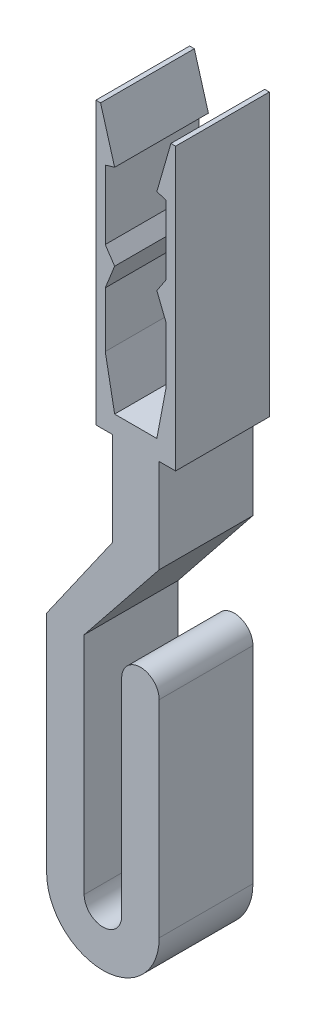
ISO-10303-21;
HEADER;
FILE_DESCRIPTION(('STEP AP214'),'2;1');
FILE_NAME('part.step','',(''),(''),'','','');
FILE_SCHEMA(('AUTOMOTIVE_DESIGN { 1 0 10303 214 1 1 1 1 }'));
ENDSEC;
DATA;
#1=APPLICATION_CONTEXT('core data for automotive mechanical design processes');
#2=APPLICATION_PROTOCOL_DEFINITION('international standard','automotive_design',2000,#1);
#3=PRODUCT_CONTEXT('',#1,'mechanical');
#4=PRODUCT('Part','Part','',(#3));
#5=PRODUCT_RELATED_PRODUCT_CATEGORY('part','',(#4));
#6=PRODUCT_DEFINITION_FORMATION('','',#4);
#7=PRODUCT_DEFINITION_CONTEXT('part definition',#1,'design');
#8=PRODUCT_DEFINITION('design','',#6,#7);
#9=PRODUCT_DEFINITION_SHAPE('','',#8);
#10=(LENGTH_UNIT() NAMED_UNIT(*) SI_UNIT(.MILLI.,.METRE.));
#11=(NAMED_UNIT(*) PLANE_ANGLE_UNIT() SI_UNIT($,.RADIAN.));
#12=(NAMED_UNIT(*) SI_UNIT($,.STERADIAN.) SOLID_ANGLE_UNIT());
#13=UNCERTAINTY_MEASURE_WITH_UNIT(LENGTH_MEASURE(1.E-05),#10,'distance_accuracy_value','');
#14=(GEOMETRIC_REPRESENTATION_CONTEXT(3) GLOBAL_UNCERTAINTY_ASSIGNED_CONTEXT((#13)) GLOBAL_UNIT_ASSIGNED_CONTEXT((#10,
#11,#12)) REPRESENTATION_CONTEXT('',''));
#15=CARTESIAN_POINT('',(0.,0.,0.));
#16=DIRECTION('',(0.,0.,1.));
#17=DIRECTION('',(1.,0.,0.));
#18=AXIS2_PLACEMENT_3D('',#15,#16,#17);
#19=CARTESIAN_POINT('',(0.85,-5.248,0.1));
#20=DIRECTION('',(0.,0.,-1.));
#21=DIRECTION('',(0.,-1.,0.));
#22=AXIS2_PLACEMENT_3D('',#19,#20,#21);
#23=PLANE('',#22);
#24=DIRECTION('',(-1.,0.,0.));
#25=VECTOR('',#24,1.);
#26=CARTESIAN_POINT('',(0.85,-0.2,0.1));
#27=LINE('',#26,#25);
#28=CARTESIAN_POINT('',(0.175,-0.2,0.1));
#29=VERTEX_POINT('',#28);
#30=CARTESIAN_POINT('',(0.,-0.2,0.1));
#31=VERTEX_POINT('',#30);
#32=EDGE_CURVE('E377',#29,#31,#27,.T.);
#33=ORIENTED_EDGE('',*,*,#32,.F.);
#34=DIRECTION('',(0.,1.,0.));
#35=VECTOR('',#34,1.);
#36=CARTESIAN_POINT('',(0.175,-1.2,0.1));
#37=LINE('',#36,#35);
#38=CARTESIAN_POINT('',(0.175,-1.2,0.1));
#39=VERTEX_POINT('',#38);
#40=EDGE_CURVE('E322',#39,#29,#37,.T.);
#41=ORIENTED_EDGE('',*,*,#40,.F.);
#42=DIRECTION('',(0.573462344363328,0.819231920519041,0.));
#43=VECTOR('',#42,1.);
#44=CARTESIAN_POINT('',(-1.50476510067114,-3.5996644295302,0.1));
#45=LINE('',#44,#43);
#46=CARTESIAN_POINT('',(-0.525,-2.2,0.1));
#47=VERTEX_POINT('',#46);
#48=EDGE_CURVE('E363',#47,#39,#45,.T.);
#49=ORIENTED_EDGE('',*,*,#48,.F.);
#50=DIRECTION('',(0.,1.,0.));
#51=VECTOR('',#50,1.);
#52=CARTESIAN_POINT('',(-0.525,-5.248,0.1));
#53=LINE('',#52,#51);
#54=CARTESIAN_POINT('',(-0.525,-4.60000000011806,0.1));
#55=VERTEX_POINT('',#54);
#56=EDGE_CURVE('E462',#55,#47,#53,.T.);
#57=ORIENTED_EDGE('',*,*,#56,.F.);
#58=CARTESIAN_POINT('',(0.075,-4.6,0.1));
#59=DIRECTION('',(0.,0.,-1.));
#60=DIRECTION('',(1.,0.,0.));
#61=AXIS2_PLACEMENT_3D('',#58,#59,#60);
#62=CIRCLE('',#61,0.60000000001);
#63=CARTESIAN_POINT('',(0.675,-4.60000000005888,0.1));
#64=VERTEX_POINT('',#63);
#65=EDGE_CURVE('E341',#64,#55,#62,.T.);
#66=ORIENTED_EDGE('',*,*,#65,.F.);
#67=DIRECTION('',(0.,-1.,0.));
#68=VECTOR('',#67,1.);
#69=CARTESIAN_POINT('',(0.675,-5.248,0.1));
#70=LINE('',#69,#68);
#71=CARTESIAN_POINT('',(0.675,-2.400000000005,0.1));
#72=VERTEX_POINT('',#71);
#73=EDGE_CURVE('E303',#72,#64,#70,.T.);
#74=ORIENTED_EDGE('',*,*,#73,.F.);
#75=CARTESIAN_POINT('',(0.475,-2.4,0.1));
#76=DIRECTION('',(0.,0.,-1.));
#77=DIRECTION('',(1.,0.,0.));
#78=AXIS2_PLACEMENT_3D('',#75,#76,#77);
#79=CIRCLE('',#78,0.20000000001);
#80=CARTESIAN_POINT('',(0.275,-2.40000000003602,0.1));
#81=VERTEX_POINT('',#80);
#82=EDGE_CURVE('E387',#81,#72,#79,.T.);
#83=ORIENTED_EDGE('',*,*,#82,.F.);
#84=DIRECTION('',(0.,1.,0.));
#85=VECTOR('',#84,1.);
#86=CARTESIAN_POINT('',(0.275,-5.248,0.1));
#87=LINE('',#86,#85);
#88=CARTESIAN_POINT('',(0.275,-4.60000000002296,0.1));
#89=VERTEX_POINT('',#88);
#90=EDGE_CURVE('E463',#89,#81,#87,.T.);
#91=ORIENTED_EDGE('',*,*,#90,.F.);
#92=CARTESIAN_POINT('',(0.075,-4.6,0.1));
#93=DIRECTION('',(0.,0.,1.));
#94=DIRECTION('',(1.,0.,0.));
#95=AXIS2_PLACEMENT_3D('',#92,#93,#94);
#96=CIRCLE('',#95,0.20000000001);
#97=CARTESIAN_POINT('',(-0.125000000005,-4.60000000003602,0.1));
#98=VERTEX_POINT('',#97);
#99=EDGE_CURVE('E251',#98,#89,#96,.T.);
#100=ORIENTED_EDGE('',*,*,#99,.F.);
#101=DIRECTION('',(0.,-1.,0.));
#102=VECTOR('',#101,1.);
#103=CARTESIAN_POINT('',(-0.125,-5.248,0.1));
#104=LINE('',#103,#102);
#105=CARTESIAN_POINT('',(-0.125,-2.2,0.1));
#106=VERTEX_POINT('',#105);
#107=EDGE_CURVE('E248',#106,#98,#104,.T.);
#108=ORIENTED_EDGE('',*,*,#107,.F.);
#109=DIRECTION('',(-0.624695047554424,-0.78086880944303,0.));
#110=VECTOR('',#109,1.);
#111=CARTESIAN_POINT('',(-1.23134146341463,-3.58292682926829,0.1));
#112=LINE('',#111,#110);
#113=CARTESIAN_POINT('',(0.675,-1.2,0.1));
#114=VERTEX_POINT('',#113);
#115=EDGE_CURVE('E234',#114,#106,#112,.T.);
#116=ORIENTED_EDGE('',*,*,#115,.F.);
#117=DIRECTION('',(0.,-1.,0.));
#118=VECTOR('',#117,1.);
#119=CARTESIAN_POINT('',(0.675,-1.2,0.1));
#120=LINE('',#119,#118);
#121=CARTESIAN_POINT('',(0.675,-0.2,0.1));
#122=VERTEX_POINT('',#121);
#123=EDGE_CURVE('E245',#122,#114,#120,.T.);
#124=ORIENTED_EDGE('',*,*,#123,.F.);
#125=DIRECTION('',(-1.,0.,0.));
#126=VECTOR('',#125,1.);
#127=CARTESIAN_POINT('',(0.85,-0.2,0.1));
#128=LINE('',#127,#126);
#129=CARTESIAN_POINT('',(0.85,-0.2,0.1));
#130=VERTEX_POINT('',#129);
#131=EDGE_CURVE('E408',#130,#122,#128,.T.);
#132=ORIENTED_EDGE('',*,*,#131,.F.);
#133=DIRECTION('',(0.,-1.,0.));
#134=VECTOR('',#133,1.);
#135=CARTESIAN_POINT('',(0.85,-5.248,0.1));
#136=LINE('',#135,#134);
#137=CARTESIAN_POINT('',(0.85,2.8,0.1));
#138=VERTEX_POINT('',#137);
#139=EDGE_CURVE('E404',#138,#130,#136,.T.);
#140=ORIENTED_EDGE('',*,*,#139,.F.);
#141=DIRECTION('',(1.,0.,0.));
#142=VECTOR('',#141,1.);
#143=CARTESIAN_POINT('',(0.85,2.8,0.1));
#144=LINE('',#143,#142);
#145=CARTESIAN_POINT('',(0.8,2.8,0.1));
#146=VERTEX_POINT('',#145);
#147=EDGE_CURVE('E329',#146,#138,#144,.T.);
#148=ORIENTED_EDGE('',*,*,#147,.F.);
#149=DIRECTION('',(0.276944772428183,0.960885837664757,0.));
#150=VECTOR('',#149,1.);
#151=CARTESIAN_POINT('',(-1.33783694764627,-4.61742560518073,0.1));
#152=LINE('',#151,#150);
#153=CARTESIAN_POINT('',(0.65,2.279560945,0.1));
#154=VERTEX_POINT('',#153);
#155=EDGE_CURVE('E328',#154,#146,#152,.T.);
#156=ORIENTED_EDGE('',*,*,#155,.F.);
#157=DIRECTION('',(-0.960885839024237,0.276944767711341,0.));
#158=VECTOR('',#157,1.);
#159=CARTESIAN_POINT('',(2.83783691688541,1.64898657067847,0.1));
#160=LINE('',#159,#158);
#161=CARTESIAN_POINT('',(0.75,2.250739127,0.1));
#162=VERTEX_POINT('',#161);
#163=EDGE_CURVE('E474',#162,#154,#160,.T.);
#164=ORIENTED_EDGE('',*,*,#163,.F.);
#165=DIRECTION('',(0.,1.,0.));
#166=VECTOR('',#165,1.);
#167=CARTESIAN_POINT('',(0.75,-5.248,0.1));
#168=LINE('',#167,#166);
#169=CARTESIAN_POINT('',(0.75,1.516264803,0.1));
#170=VERTEX_POINT('',#169);
#171=EDGE_CURVE('E473',#170,#162,#168,.T.);
#172=ORIENTED_EDGE('',*,*,#171,.F.);
#173=DIRECTION('',(0.55470019622523,0.832050294337843,0.));
#174=VECTOR('',#173,1.);
#175=CARTESIAN_POINT('',(-2.34119913984616,-3.12053390676923,0.1));
#176=LINE('',#175,#174);
#177=CARTESIAN_POINT('',(0.65,1.366264803,0.1));
#178=VERTEX_POINT('',#177);
#179=EDGE_CURVE('E370',#178,#170,#176,.T.);
#180=ORIENTED_EDGE('',*,*,#179,.F.);
#181=DIRECTION('',(-0.371390676354104,0.928476690885259,0.));
#182=VECTOR('',#181,1.);
#183=CARTESIAN_POINT('',(2.95836717344828,-4.40465313062069,0.1));
#184=LINE('',#183,#182);
#185=CARTESIAN_POINT('',(0.75,1.116264803,0.1));
#186=VERTEX_POINT('',#185);
#187=EDGE_CURVE('E284',#186,#178,#184,.T.);
#188=ORIENTED_EDGE('',*,*,#187,.F.);
#189=DIRECTION('',(0.,1.,0.));
#190=VECTOR('',#189,1.);
#191=CARTESIAN_POINT('',(0.75,-5.248,0.1));
#192=LINE('',#191,#190);
#193=CARTESIAN_POINT('',(0.75,0.527464379,0.1));
#194=VERTEX_POINT('',#193);
#195=EDGE_CURVE('E442',#194,#186,#192,.T.);
#196=ORIENTED_EDGE('',*,*,#195,.F.);
#197=DIRECTION('',(0.186268297140006,0.982498916783404,0.));
#198=VECTOR('',#197,1.);
#199=CARTESIAN_POINT('',(-0.30348890839428,-5.02931434949576,0.1));
#200=LINE('',#199,#198);
#201=CARTESIAN_POINT('',(0.65,0.,0.1));
#202=VERTEX_POINT('',#201);
#203=EDGE_CURVE('E308',#202,#194,#200,.T.);
#204=ORIENTED_EDGE('',*,*,#203,.F.);
#205=DIRECTION('',(-1.,0.,0.));
#206=VECTOR('',#205,1.);
#207=CARTESIAN_POINT('',(0.85,0.,0.1));
#208=LINE('',#207,#206);
#209=CARTESIAN_POINT('',(0.2,0.,0.1));
#210=VERTEX_POINT('',#209);
#211=EDGE_CURVE('E293',#202,#210,#208,.T.);
#212=ORIENTED_EDGE('',*,*,#211,.T.);
#213=DIRECTION('',(-0.186268297140006,0.982498916783404,0.));
#214=VECTOR('',#213,1.);
#215=CARTESIAN_POINT('',(1.1829804051358,-5.18487148964124,0.1));
#216=LINE('',#215,#214);
#217=CARTESIAN_POINT('',(0.1,0.527464379000001,0.1));
#218=VERTEX_POINT('',#217);
#219=EDGE_CURVE('E292',#210,#218,#216,.T.);
#220=ORIENTED_EDGE('',*,*,#219,.T.);
#221=DIRECTION('',(0.,1.,0.));
#222=VECTOR('',#221,1.);
#223=CARTESIAN_POINT('',(0.1,-5.248,0.1));
#224=LINE('',#223,#222);
#225=CARTESIAN_POINT('',(0.1,1.116264803,0.1));
#226=VERTEX_POINT('',#225);
#227=EDGE_CURVE('E554',#218,#226,#224,.T.);
#228=ORIENTED_EDGE('',*,*,#227,.T.);
#229=DIRECTION('',(0.371390676354104,0.928476690885259,0.));
#230=VECTOR('',#229,1.);
#231=CARTESIAN_POINT('',(-1.99112579413793,-4.11154968234483,0.1));
#232=LINE('',#231,#230);
#233=CARTESIAN_POINT('',(0.2,1.366264803,0.1));
#234=VERTEX_POINT('',#233);
#235=EDGE_CURVE('E392',#226,#234,#232,.T.);
#236=ORIENTED_EDGE('',*,*,#235,.T.);
#237=DIRECTION('',(-0.554700196225229,0.832050294337844,0.));
#238=VECTOR('',#237,1.);
#239=CARTESIAN_POINT('',(3.45273760138462,-3.51284159907692,0.1));
#240=LINE('',#239,#238);
#241=CARTESIAN_POINT('',(0.1,1.516264803,0.1));
#242=VERTEX_POINT('',#241);
#243=EDGE_CURVE('E479',#234,#242,#240,.T.);
#244=ORIENTED_EDGE('',*,*,#243,.T.);
#245=DIRECTION('',(0.,1.,0.));
#246=VECTOR('',#245,1.);
#247=CARTESIAN_POINT('',(0.1,-5.248,0.1));
#248=LINE('',#247,#246);
#249=CARTESIAN_POINT('',(0.1,2.250739127,0.1));
#250=VERTEX_POINT('',#249);
#251=EDGE_CURVE('E398',#242,#250,#248,.T.);
#252=ORIENTED_EDGE('',*,*,#251,.T.);
#253=DIRECTION('',(0.960885839024237,0.276944767711341,0.));
#254=VECTOR('',#253,1.);
#255=CARTESIAN_POINT('',(-1.20303056059369,1.8751820303413,0.1));
#256=LINE('',#255,#254);
#257=CARTESIAN_POINT('',(0.2,2.279560945,0.1));
#258=VERTEX_POINT('',#257);
#259=EDGE_CURVE('E298',#250,#258,#256,.T.);
#260=ORIENTED_EDGE('',*,*,#259,.T.);
#261=DIRECTION('',(-0.276944772428183,0.960885837664757,0.));
#262=VECTOR('',#261,1.);
#263=CARTESIAN_POINT('',(2.25303059357528,-4.84362106837603,0.1));
#264=LINE('',#263,#262);
#265=CARTESIAN_POINT('',(0.05,2.8,0.1));
#266=VERTEX_POINT('',#265);
#267=EDGE_CURVE('E297',#258,#266,#264,.T.);
#268=ORIENTED_EDGE('',*,*,#267,.T.);
#269=DIRECTION('',(-1.,0.,0.));
#270=VECTOR('',#269,1.);
#271=CARTESIAN_POINT('',(0.85,2.8,0.1));
#272=LINE('',#271,#270);
#273=CARTESIAN_POINT('',(0.,2.8,0.1));
#274=VERTEX_POINT('',#273);
#275=EDGE_CURVE('E27',#266,#274,#272,.T.);
#276=ORIENTED_EDGE('',*,*,#275,.T.);
#277=DIRECTION('',(0.,-1.,0.));
#278=VECTOR('',#277,1.);
#279=CARTESIAN_POINT('',(0.,-5.248,0.1));
#280=LINE('',#279,#278);
#281=EDGE_CURVE('E11',#274,#31,#280,.T.);
#282=ORIENTED_EDGE('',*,*,#281,.T.);
#283=EDGE_LOOP('',(#33,#41,#49,#57,#66,#74,#83,#91,#100,#108,#116,#124,#132,#140,#148,#156,#164,
#172,#180,#188,#196,#204,#212,#220,#228,#236,#244,#252,#260,#268,#276,#282));
#284=FACE_BOUND('',#283,.T.);
#285=ADVANCED_FACE('F16',(#284),#23,.F.);
#286=CARTESIAN_POINT('',(0.,-0.2,0.1));
#287=DIRECTION('',(1.,0.,0.));
#288=DIRECTION('',(0.,1.,0.));
#289=AXIS2_PLACEMENT_3D('',#286,#287,#288);
#290=PLANE('',#289);
#291=DIRECTION('',(0.,1.,0.));
#292=VECTOR('',#291,1.);
#293=CARTESIAN_POINT('',(0.,-0.2,-0.9));
#294=LINE('',#293,#292);
#295=CARTESIAN_POINT('',(0.,-0.2,-0.9));
#296=VERTEX_POINT('',#295);
#297=CARTESIAN_POINT('',(0.,2.8,-0.9));
#298=VERTEX_POINT('',#297);
#299=EDGE_CURVE('E358',#296,#298,#294,.T.);
#300=ORIENTED_EDGE('',*,*,#299,.F.);
#301=DIRECTION('',(0.,0.,-1.));
#302=VECTOR('',#301,1.);
#303=CARTESIAN_POINT('',(0.,-0.2,0.1));
#304=LINE('',#303,#302);
#305=EDGE_CURVE('E369',#31,#296,#304,.T.);
#306=ORIENTED_EDGE('',*,*,#305,.F.);
#307=ORIENTED_EDGE('',*,*,#281,.F.);
#308=DIRECTION('',(0.,0.,-1.));
#309=VECTOR('',#308,1.);
#310=CARTESIAN_POINT('',(0.,2.8,0.1));
#311=LINE('',#310,#309);
#312=EDGE_CURVE('E332',#274,#298,#311,.T.);
#313=ORIENTED_EDGE('',*,*,#312,.T.);
#314=EDGE_LOOP('',(#300,#306,#307,#313));
#315=FACE_BOUND('',#314,.T.);
#316=ADVANCED_FACE('F515',(#315),#290,.F.);
#317=CARTESIAN_POINT('',(0.,2.8,0.1));
#318=DIRECTION('',(0.,-1.,0.));
#319=DIRECTION('',(0.,0.,-1.));
#320=AXIS2_PLACEMENT_3D('',#317,#318,#319);
#321=PLANE('',#320);
#322=DIRECTION('',(1.,0.,0.));
#323=VECTOR('',#322,1.);
#324=CARTESIAN_POINT('',(0.,2.8,-0.9));
#325=LINE('',#324,#323);
#326=CARTESIAN_POINT('',(0.05,2.8,-0.9));
#327=VERTEX_POINT('',#326);
#328=EDGE_CURVE('E353',#298,#327,#325,.T.);
#329=ORIENTED_EDGE('',*,*,#328,.F.);
#330=ORIENTED_EDGE('',*,*,#312,.F.);
#331=ORIENTED_EDGE('',*,*,#275,.F.);
#332=DIRECTION('',(0.,0.,-1.));
#333=VECTOR('',#332,1.);
#334=CARTESIAN_POINT('',(0.05,2.8,0.1));
#335=LINE('',#334,#333);
#336=EDGE_CURVE('E294',#266,#327,#335,.T.);
#337=ORIENTED_EDGE('',*,*,#336,.T.);
#338=EDGE_LOOP('',(#329,#330,#331,#337));
#339=FACE_BOUND('',#338,.T.);
#340=ADVANCED_FACE('F523',(#339),#321,.F.);
#341=CARTESIAN_POINT('',(0.05,2.8,-0.9));
#342=DIRECTION('',(-0.960885837664757,-0.276944772428183,0.));
#343=DIRECTION('',(-0.276944772428183,0.960885837664757,0.));
#344=AXIS2_PLACEMENT_3D('',#341,#342,#343);
#345=PLANE('',#344);
#346=DIRECTION('',(0.276944772428183,-0.960885837664757,0.));
#347=VECTOR('',#346,1.);
#348=CARTESIAN_POINT('',(0.05,2.8,-0.9));
#349=LINE('',#348,#347);
#350=CARTESIAN_POINT('',(0.2,2.279560945,-0.9));
#351=VERTEX_POINT('',#350);
#352=EDGE_CURVE('E357',#327,#351,#349,.T.);
#353=ORIENTED_EDGE('',*,*,#352,.F.);
#354=ORIENTED_EDGE('',*,*,#336,.F.);
#355=ORIENTED_EDGE('',*,*,#267,.F.);
#356=DIRECTION('',(0.,0.,-1.));
#357=VECTOR('',#356,1.);
#358=CARTESIAN_POINT('',(0.2,2.279560945,-0.9));
#359=LINE('',#358,#357);
#360=EDGE_CURVE('E402',#258,#351,#359,.T.);
#361=ORIENTED_EDGE('',*,*,#360,.T.);
#362=EDGE_LOOP('',(#353,#354,#355,#361));
#363=FACE_BOUND('',#362,.T.);
#364=ADVANCED_FACE('F529',(#363),#345,.F.);
#365=CARTESIAN_POINT('',(0.2,2.279560945,-0.9));
#366=DIRECTION('',(-0.276944767711341,0.960885839024237,0.));
#367=DIRECTION('',(0.,0.,1.));
#368=AXIS2_PLACEMENT_3D('',#365,#366,#367);
#369=PLANE('',#368);
#370=DIRECTION('',(-0.960885839024237,-0.276944767711341,0.));
#371=VECTOR('',#370,1.);
#372=CARTESIAN_POINT('',(0.2,2.279560945,-0.9));
#373=LINE('',#372,#371);
#374=CARTESIAN_POINT('',(0.1,2.250739127,-0.9));
#375=VERTEX_POINT('',#374);
#376=EDGE_CURVE('E449',#351,#375,#373,.T.);
#377=ORIENTED_EDGE('',*,*,#376,.F.);
#378=ORIENTED_EDGE('',*,*,#360,.F.);
#379=ORIENTED_EDGE('',*,*,#259,.F.);
#380=DIRECTION('',(0.,0.,-1.));
#381=VECTOR('',#380,1.);
#382=CARTESIAN_POINT('',(0.1,2.250739127,-0.9));
#383=LINE('',#382,#381);
#384=EDGE_CURVE('E403',#250,#375,#383,.T.);
#385=ORIENTED_EDGE('',*,*,#384,.T.);
#386=EDGE_LOOP('',(#377,#378,#379,#385));
#387=FACE_BOUND('',#386,.T.);
#388=ADVANCED_FACE('F534',(#387),#369,.F.);
#389=CARTESIAN_POINT('',(0.1,2.250739127,-0.9));
#390=DIRECTION('',(-1.,0.,0.));
#391=DIRECTION('',(0.,0.,1.));
#392=AXIS2_PLACEMENT_3D('',#389,#390,#391);
#393=PLANE('',#392);
#394=DIRECTION('',(0.,-1.,0.));
#395=VECTOR('',#394,1.);
#396=CARTESIAN_POINT('',(0.1,2.250739127,-0.9));
#397=LINE('',#396,#395);
#398=CARTESIAN_POINT('',(0.1,1.516264803,-0.9));
#399=VERTEX_POINT('',#398);
#400=EDGE_CURVE('E538',#375,#399,#397,.T.);
#401=ORIENTED_EDGE('',*,*,#400,.F.);
#402=ORIENTED_EDGE('',*,*,#384,.F.);
#403=ORIENTED_EDGE('',*,*,#251,.F.);
#404=DIRECTION('',(0.,0.,-1.));
#405=VECTOR('',#404,1.);
#406=CARTESIAN_POINT('',(0.1,1.516264803,-0.9));
#407=LINE('',#406,#405);
#408=EDGE_CURVE('E396',#242,#399,#407,.T.);
#409=ORIENTED_EDGE('',*,*,#408,.T.);
#410=EDGE_LOOP('',(#401,#402,#403,#409));
#411=FACE_BOUND('',#410,.T.);
#412=ADVANCED_FACE('F879',(#411),#393,.F.);
#413=CARTESIAN_POINT('',(0.1,1.516264803,-0.9));
#414=DIRECTION('',(-0.832050294337844,-0.554700196225229,0.));
#415=DIRECTION('',(-0.554700196225229,0.832050294337844,0.));
#416=AXIS2_PLACEMENT_3D('',#413,#414,#415);
#417=PLANE('',#416);
#418=DIRECTION('',(0.554700196225229,-0.832050294337844,0.));
#419=VECTOR('',#418,1.);
#420=CARTESIAN_POINT('',(0.1,1.516264803,-0.9));
#421=LINE('',#420,#419);
#422=CARTESIAN_POINT('',(0.2,1.366264803,-0.9));
#423=VERTEX_POINT('',#422);
#424=EDGE_CURVE('E543',#399,#423,#421,.T.);
#425=ORIENTED_EDGE('',*,*,#424,.F.);
#426=ORIENTED_EDGE('',*,*,#408,.F.);
#427=ORIENTED_EDGE('',*,*,#243,.F.);
#428=DIRECTION('',(0.,0.,-1.));
#429=VECTOR('',#428,1.);
#430=CARTESIAN_POINT('',(0.2,1.366264803,-0.9));
#431=LINE('',#430,#429);
#432=EDGE_CURVE('E397',#234,#423,#431,.T.);
#433=ORIENTED_EDGE('',*,*,#432,.T.);
#434=EDGE_LOOP('',(#425,#426,#427,#433));
#435=FACE_BOUND('',#434,.T.);
#436=ADVANCED_FACE('F881',(#435),#417,.F.);
#437=CARTESIAN_POINT('',(0.2,1.366264803,-0.9));
#438=DIRECTION('',(-0.92847669088526,0.371390676354103,0.));
#439=DIRECTION('',(0.,0.,1.));
#440=AXIS2_PLACEMENT_3D('',#437,#438,#439);
#441=PLANE('',#440);
#442=DIRECTION('',(-0.371390676354104,-0.928476690885259,0.));
#443=VECTOR('',#442,1.);
#444=CARTESIAN_POINT('',(0.2,1.366264803,-0.9));
#445=LINE('',#444,#443);
#446=CARTESIAN_POINT('',(0.1,1.116264803,-0.9));
#447=VERTEX_POINT('',#446);
#448=EDGE_CURVE('E569',#423,#447,#445,.T.);
#449=ORIENTED_EDGE('',*,*,#448,.F.);
#450=ORIENTED_EDGE('',*,*,#432,.F.);
#451=ORIENTED_EDGE('',*,*,#235,.F.);
#452=DIRECTION('',(0.,0.,-1.));
#453=VECTOR('',#452,1.);
#454=CARTESIAN_POINT('',(0.1,1.116264803,-0.9));
#455=LINE('',#454,#453);
#456=EDGE_CURVE('E478',#226,#447,#455,.T.);
#457=ORIENTED_EDGE('',*,*,#456,.T.);
#458=EDGE_LOOP('',(#449,#450,#451,#457));
#459=FACE_BOUND('',#458,.T.);
#460=ADVANCED_FACE('F580',(#459),#441,.F.);
#461=CARTESIAN_POINT('',(0.1,1.116264803,-0.9));
#462=DIRECTION('',(-1.,0.,0.));
#463=DIRECTION('',(0.,0.,1.));
#464=AXIS2_PLACEMENT_3D('',#461,#462,#463);
#465=PLANE('',#464);
#466=DIRECTION('',(0.,-1.,0.));
#467=VECTOR('',#466,1.);
#468=CARTESIAN_POINT('',(0.1,1.116264803,-0.9));
#469=LINE('',#468,#467);
#470=CARTESIAN_POINT('',(0.1,0.527464379,-0.9));
#471=VERTEX_POINT('',#470);
#472=EDGE_CURVE('E572',#447,#471,#469,.T.);
#473=ORIENTED_EDGE('',*,*,#472,.F.);
#474=ORIENTED_EDGE('',*,*,#456,.F.);
#475=ORIENTED_EDGE('',*,*,#227,.F.);
#476=DIRECTION('',(0.,0.,-1.));
#477=VECTOR('',#476,1.);
#478=CARTESIAN_POINT('',(0.1,0.527464379,-0.9));
#479=LINE('',#478,#477);
#480=EDGE_CURVE('E289',#218,#471,#479,.T.);
#481=ORIENTED_EDGE('',*,*,#480,.T.);
#482=EDGE_LOOP('',(#473,#474,#475,#481));
#483=FACE_BOUND('',#482,.T.);
#484=ADVANCED_FACE('F586',(#483),#465,.F.);
#485=CARTESIAN_POINT('',(0.1,0.527464379,-0.9));
#486=DIRECTION('',(-0.982498916783404,-0.186268297140006,0.));
#487=DIRECTION('',(-0.186268297140006,0.982498916783404,0.));
#488=AXIS2_PLACEMENT_3D('',#485,#486,#487);
#489=PLANE('',#488);
#490=DIRECTION('',(0.186268297140006,-0.982498916783404,0.));
#491=VECTOR('',#490,1.);
#492=CARTESIAN_POINT('',(0.1,0.527464379,-0.9));
#493=LINE('',#492,#491);
#494=CARTESIAN_POINT('',(0.2,0.,-0.9));
#495=VERTEX_POINT('',#494);
#496=EDGE_CURVE('E416',#471,#495,#493,.T.);
#497=ORIENTED_EDGE('',*,*,#496,.F.);
#498=ORIENTED_EDGE('',*,*,#480,.F.);
#499=ORIENTED_EDGE('',*,*,#219,.F.);
#500=DIRECTION('',(0.,0.,-1.));
#501=VECTOR('',#500,1.);
#502=CARTESIAN_POINT('',(0.2,0.,0.1));
#503=LINE('',#502,#501);
#504=EDGE_CURVE('E312',#210,#495,#503,.T.);
#505=ORIENTED_EDGE('',*,*,#504,.T.);
#506=EDGE_LOOP('',(#497,#498,#499,#505));
#507=FACE_BOUND('',#506,.T.);
#508=ADVANCED_FACE('F18',(#507),#489,.F.);
#509=CARTESIAN_POINT('',(0.2,0.,0.1));
#510=DIRECTION('',(0.,-1.,0.));
#511=DIRECTION('',(0.,0.,-1.));
#512=AXIS2_PLACEMENT_3D('',#509,#510,#511);
#513=PLANE('',#512);
#514=DIRECTION('',(1.,0.,0.));
#515=VECTOR('',#514,1.);
#516=CARTESIAN_POINT('',(0.2,0.,-0.9));
#517=LINE('',#516,#515);
#518=CARTESIAN_POINT('',(0.65,0.,-0.9));
#519=VERTEX_POINT('',#518);
#520=EDGE_CURVE('E412',#495,#519,#517,.T.);
#521=ORIENTED_EDGE('',*,*,#520,.F.);
#522=ORIENTED_EDGE('',*,*,#504,.F.);
#523=ORIENTED_EDGE('',*,*,#211,.F.);
#524=DIRECTION('',(0.,0.,1.));
#525=VECTOR('',#524,1.);
#526=CARTESIAN_POINT('',(0.65,0.,-0.9));
#527=LINE('',#526,#525);
#528=EDGE_CURVE('E313',#519,#202,#527,.T.);
#529=ORIENTED_EDGE('',*,*,#528,.F.);
#530=EDGE_LOOP('',(#521,#522,#523,#529));
#531=FACE_BOUND('',#530,.T.);
#532=ADVANCED_FACE('F1158',(#531),#513,.F.);
#533=CARTESIAN_POINT('',(0.75,0.527464379,-0.9));
#534=DIRECTION('',(-0.982498916783404,0.186268297140006,0.));
#535=DIRECTION('',(0.,0.,1.));
#536=AXIS2_PLACEMENT_3D('',#533,#534,#535);
#537=PLANE('',#536);
#538=ORIENTED_EDGE('',*,*,#528,.T.);
#539=ORIENTED_EDGE('',*,*,#203,.T.);
#540=DIRECTION('',(0.,0.,1.));
#541=VECTOR('',#540,1.);
#542=CARTESIAN_POINT('',(0.75,0.527464379,-0.9));
#543=LINE('',#542,#541);
#544=CARTESIAN_POINT('',(0.75,0.527464378999999,-0.9));
#545=VERTEX_POINT('',#544);
#546=EDGE_CURVE('E288',#545,#194,#543,.T.);
#547=ORIENTED_EDGE('',*,*,#546,.F.);
#548=DIRECTION('',(0.186268297140006,0.982498916783404,0.));
#549=VECTOR('',#548,1.);
#550=CARTESIAN_POINT('',(-0.30348890839428,-5.02931434949576,-0.9));
#551=LINE('',#550,#549);
#552=EDGE_CURVE('E302',#519,#545,#551,.T.);
#553=ORIENTED_EDGE('',*,*,#552,.F.);
#554=EDGE_LOOP('',(#538,#539,#547,#553));
#555=FACE_BOUND('',#554,.T.);
#556=ADVANCED_FACE('F1147',(#555),#537,.T.);
#557=CARTESIAN_POINT('',(0.75,1.116264803,-0.9));
#558=DIRECTION('',(-1.,0.,0.));
#559=DIRECTION('',(0.,0.,1.));
#560=AXIS2_PLACEMENT_3D('',#557,#558,#559);
#561=PLANE('',#560);
#562=ORIENTED_EDGE('',*,*,#546,.T.);
#563=ORIENTED_EDGE('',*,*,#195,.T.);
#564=DIRECTION('',(0.,0.,1.));
#565=VECTOR('',#564,1.);
#566=CARTESIAN_POINT('',(0.75,1.116264803,-0.9));
#567=LINE('',#566,#565);
#568=CARTESIAN_POINT('',(0.75,1.116264803,-0.9));
#569=VERTEX_POINT('',#568);
#570=EDGE_CURVE('E270',#569,#186,#567,.T.);
#571=ORIENTED_EDGE('',*,*,#570,.F.);
#572=DIRECTION('',(0.,1.,0.));
#573=VECTOR('',#572,1.);
#574=CARTESIAN_POINT('',(0.75,-5.248,-0.9));
#575=LINE('',#574,#573);
#576=EDGE_CURVE('E283',#545,#569,#575,.T.);
#577=ORIENTED_EDGE('',*,*,#576,.F.);
#578=EDGE_LOOP('',(#562,#563,#571,#577));
#579=FACE_BOUND('',#578,.T.);
#580=ADVANCED_FACE('F924',(#579),#561,.T.);
#581=CARTESIAN_POINT('',(0.65,1.366264803,-0.9));
#582=DIRECTION('',(-0.928476690885259,-0.371390676354104,0.));
#583=DIRECTION('',(-0.371390676354104,0.928476690885259,0.));
#584=AXIS2_PLACEMENT_3D('',#581,#582,#583);
#585=PLANE('',#584);
#586=ORIENTED_EDGE('',*,*,#570,.T.);
#587=ORIENTED_EDGE('',*,*,#187,.T.);
#588=DIRECTION('',(0.,0.,1.));
#589=VECTOR('',#588,1.);
#590=CARTESIAN_POINT('',(0.65,1.366264803,-0.9));
#591=LINE('',#590,#589);
#592=CARTESIAN_POINT('',(0.65,1.366264803,-0.9));
#593=VERTEX_POINT('',#592);
#594=EDGE_CURVE('E373',#593,#178,#591,.T.);
#595=ORIENTED_EDGE('',*,*,#594,.F.);
#596=DIRECTION('',(-0.371390676354104,0.928476690885259,0.));
#597=VECTOR('',#596,1.);
#598=CARTESIAN_POINT('',(2.95836717344828,-4.40465313062069,-0.9));
#599=LINE('',#598,#597);
#600=EDGE_CURVE('E278',#569,#593,#599,.T.);
#601=ORIENTED_EDGE('',*,*,#600,.F.);
#602=EDGE_LOOP('',(#586,#587,#595,#601));
#603=FACE_BOUND('',#602,.T.);
#604=ADVANCED_FACE('F911',(#603),#585,.T.);
#605=CARTESIAN_POINT('',(0.75,1.516264803,-0.9));
#606=DIRECTION('',(-0.832050294337843,0.55470019622523,0.));
#607=DIRECTION('',(0.,0.,1.));
#608=AXIS2_PLACEMENT_3D('',#605,#606,#607);
#609=PLANE('',#608);
#610=ORIENTED_EDGE('',*,*,#594,.T.);
#611=ORIENTED_EDGE('',*,*,#179,.T.);
#612=DIRECTION('',(0.,0.,1.));
#613=VECTOR('',#612,1.);
#614=CARTESIAN_POINT('',(0.75,1.516264803,-0.9));
#615=LINE('',#614,#613);
#616=CARTESIAN_POINT('',(0.75,1.516264803,-0.9));
#617=VERTEX_POINT('',#616);
#618=EDGE_CURVE('E469',#617,#170,#615,.T.);
#619=ORIENTED_EDGE('',*,*,#618,.F.);
#620=DIRECTION('',(0.55470019622523,0.832050294337843,0.));
#621=VECTOR('',#620,1.);
#622=CARTESIAN_POINT('',(-2.34119913984616,-3.12053390676923,-0.9));
#623=LINE('',#622,#621);
#624=EDGE_CURVE('E282',#593,#617,#623,.T.);
#625=ORIENTED_EDGE('',*,*,#624,.F.);
#626=EDGE_LOOP('',(#610,#611,#619,#625));
#627=FACE_BOUND('',#626,.T.);
#628=ADVANCED_FACE('F908',(#627),#609,.T.);
#629=CARTESIAN_POINT('',(0.75,2.250739127,-0.9));
#630=DIRECTION('',(-1.,0.,0.));
#631=DIRECTION('',(0.,0.,1.));
#632=AXIS2_PLACEMENT_3D('',#629,#630,#631);
#633=PLANE('',#632);
#634=ORIENTED_EDGE('',*,*,#618,.T.);
#635=ORIENTED_EDGE('',*,*,#171,.T.);
#636=DIRECTION('',(0.,0.,1.));
#637=VECTOR('',#636,1.);
#638=CARTESIAN_POINT('',(0.75,2.250739127,-0.9));
#639=LINE('',#638,#637);
#640=CARTESIAN_POINT('',(0.75,2.250739127,-0.9));
#641=VERTEX_POINT('',#640);
#642=EDGE_CURVE('E560',#641,#162,#639,.T.);
#643=ORIENTED_EDGE('',*,*,#642,.F.);
#644=DIRECTION('',(0.,1.,0.));
#645=VECTOR('',#644,1.);
#646=CARTESIAN_POINT('',(0.75,-5.248,-0.9));
#647=LINE('',#646,#645);
#648=EDGE_CURVE('E564',#617,#641,#647,.T.);
#649=ORIENTED_EDGE('',*,*,#648,.F.);
#650=EDGE_LOOP('',(#634,#635,#643,#649));
#651=FACE_BOUND('',#650,.T.);
#652=ADVANCED_FACE('F816',(#651),#633,.T.);
#653=CARTESIAN_POINT('',(0.65,2.279560945,-0.9));
#654=DIRECTION('',(-0.276944767711341,-0.960885839024237,0.));
#655=DIRECTION('',(-0.960885839024237,0.276944767711341,0.));
#656=AXIS2_PLACEMENT_3D('',#653,#654,#655);
#657=PLANE('',#656);
#658=ORIENTED_EDGE('',*,*,#642,.T.);
#659=ORIENTED_EDGE('',*,*,#163,.T.);
#660=DIRECTION('',(0.,0.,1.));
#661=VECTOR('',#660,1.);
#662=CARTESIAN_POINT('',(0.65,2.279560945,-0.9));
#663=LINE('',#662,#661);
#664=CARTESIAN_POINT('',(0.65,2.279560945,-0.9));
#665=VERTEX_POINT('',#664);
#666=EDGE_CURVE('E324',#665,#154,#663,.T.);
#667=ORIENTED_EDGE('',*,*,#666,.F.);
#668=DIRECTION('',(-0.960885839024237,0.276944767711341,0.));
#669=VECTOR('',#668,1.);
#670=CARTESIAN_POINT('',(2.83783691688541,1.64898657067847,-0.9));
#671=LINE('',#670,#669);
#672=EDGE_CURVE('E352',#641,#665,#671,.T.);
#673=ORIENTED_EDGE('',*,*,#672,.F.);
#674=EDGE_LOOP('',(#658,#659,#667,#673));
#675=FACE_BOUND('',#674,.T.);
#676=ADVANCED_FACE('F903',(#675),#657,.T.);
#677=CARTESIAN_POINT('',(0.8,2.8,-0.9));
#678=DIRECTION('',(-0.960885837664757,0.276944772428183,0.));
#679=DIRECTION('',(0.,0.,1.));
#680=AXIS2_PLACEMENT_3D('',#677,#678,#679);
#681=PLANE('',#680);
#682=ORIENTED_EDGE('',*,*,#666,.T.);
#683=ORIENTED_EDGE('',*,*,#155,.T.);
#684=DIRECTION('',(0.,0.,1.));
#685=VECTOR('',#684,1.);
#686=CARTESIAN_POINT('',(0.8,2.8,-0.9));
#687=LINE('',#686,#685);
#688=CARTESIAN_POINT('',(0.8,2.8,-0.9));
#689=VERTEX_POINT('',#688);
#690=EDGE_CURVE('E348',#689,#146,#687,.T.);
#691=ORIENTED_EDGE('',*,*,#690,.F.);
#692=DIRECTION('',(0.276944772428183,0.960885837664757,0.));
#693=VECTOR('',#692,1.);
#694=CARTESIAN_POINT('',(-1.33783694764627,-4.61742560518073,-0.9));
#695=LINE('',#694,#693);
#696=EDGE_CURVE('E277',#665,#689,#695,.T.);
#697=ORIENTED_EDGE('',*,*,#696,.F.);
#698=EDGE_LOOP('',(#682,#683,#691,#697));
#699=FACE_BOUND('',#698,.T.);
#700=ADVANCED_FACE('F906',(#699),#681,.T.);
#701=CARTESIAN_POINT('',(0.8,2.8,-0.9));
#702=DIRECTION('',(0.,1.,0.));
#703=DIRECTION('',(1.,0.,0.));
#704=AXIS2_PLACEMENT_3D('',#701,#702,#703);
#705=PLANE('',#704);
#706=ORIENTED_EDGE('',*,*,#690,.T.);
#707=ORIENTED_EDGE('',*,*,#147,.T.);
#708=DIRECTION('',(0.,0.,1.));
#709=VECTOR('',#708,1.);
#710=CARTESIAN_POINT('',(0.85,2.8,0.1));
#711=LINE('',#710,#709);
#712=CARTESIAN_POINT('',(0.85,2.8,-0.9));
#713=VERTEX_POINT('',#712);
#714=EDGE_CURVE('E407',#713,#138,#711,.T.);
#715=ORIENTED_EDGE('',*,*,#714,.F.);
#716=DIRECTION('',(1.,0.,0.));
#717=VECTOR('',#716,1.);
#718=CARTESIAN_POINT('',(0.85,2.8,-0.9));
#719=LINE('',#718,#717);
#720=EDGE_CURVE('E272',#689,#713,#719,.T.);
#721=ORIENTED_EDGE('',*,*,#720,.F.);
#722=EDGE_LOOP('',(#706,#707,#715,#721));
#723=FACE_BOUND('',#722,.T.);
#724=ADVANCED_FACE('F914',(#723),#705,.T.);
#725=CARTESIAN_POINT('',(0.85,-0.2,0.1));
#726=DIRECTION('',(1.,0.,0.));
#727=DIRECTION('',(0.,1.,0.));
#728=AXIS2_PLACEMENT_3D('',#725,#726,#727);
#729=PLANE('',#728);
#730=ORIENTED_EDGE('',*,*,#139,.T.);
#731=DIRECTION('',(0.,0.,1.));
#732=VECTOR('',#731,1.);
#733=CARTESIAN_POINT('',(0.85,-0.2,0.1));
#734=LINE('',#733,#732);
#735=CARTESIAN_POINT('',(0.85,-0.2,-0.9));
#736=VERTEX_POINT('',#735);
#737=EDGE_CURVE('E317',#736,#130,#734,.T.);
#738=ORIENTED_EDGE('',*,*,#737,.F.);
#739=DIRECTION('',(0.,-1.,0.));
#740=VECTOR('',#739,1.);
#741=CARTESIAN_POINT('',(0.85,-5.248,-0.9));
#742=LINE('',#741,#740);
#743=EDGE_CURVE('E276',#713,#736,#742,.T.);
#744=ORIENTED_EDGE('',*,*,#743,.F.);
#745=ORIENTED_EDGE('',*,*,#714,.T.);
#746=EDGE_LOOP('',(#730,#738,#744,#745));
#747=FACE_BOUND('',#746,.T.);
#748=ADVANCED_FACE('F930',(#747),#729,.T.);
#749=CARTESIAN_POINT('',(0.675,-0.2,0.1));
#750=DIRECTION('',(0.,-1.,0.));
#751=DIRECTION('',(0.,0.,-1.));
#752=AXIS2_PLACEMENT_3D('',#749,#750,#751);
#753=PLANE('',#752);
#754=ORIENTED_EDGE('',*,*,#737,.T.);
#755=ORIENTED_EDGE('',*,*,#131,.T.);
#756=DIRECTION('',(0.,0.,-1.));
#757=VECTOR('',#756,1.);
#758=CARTESIAN_POINT('',(0.675,-0.2,0.1));
#759=LINE('',#758,#757);
#760=CARTESIAN_POINT('',(0.675,-0.2,-0.9));
#761=VERTEX_POINT('',#760);
#762=EDGE_CURVE('E314',#122,#761,#759,.T.);
#763=ORIENTED_EDGE('',*,*,#762,.T.);
#764=DIRECTION('',(-1.,0.,0.));
#765=VECTOR('',#764,1.);
#766=CARTESIAN_POINT('',(0.85,-0.2,-0.9));
#767=LINE('',#766,#765);
#768=EDGE_CURVE('E438',#736,#761,#767,.T.);
#769=ORIENTED_EDGE('',*,*,#768,.F.);
#770=EDGE_LOOP('',(#754,#755,#763,#769));
#771=FACE_BOUND('',#770,.T.);
#772=ADVANCED_FACE('F934',(#771),#753,.T.);
#773=CARTESIAN_POINT('',(0.675,-1.2,-0.9));
#774=DIRECTION('',(-1.,0.,0.));
#775=DIRECTION('',(0.,0.,1.));
#776=AXIS2_PLACEMENT_3D('',#773,#774,#775);
#777=PLANE('',#776);
#778=ORIENTED_EDGE('',*,*,#123,.T.);
#779=DIRECTION('',(0.,0.,1.));
#780=VECTOR('',#779,1.);
#781=CARTESIAN_POINT('',(0.675,-1.2,-0.9));
#782=LINE('',#781,#780);
#783=CARTESIAN_POINT('',(0.675,-1.2,-0.9));
#784=VERTEX_POINT('',#783);
#785=EDGE_CURVE('E241',#784,#114,#782,.T.);
#786=ORIENTED_EDGE('',*,*,#785,.F.);
#787=DIRECTION('',(0.,-1.,0.));
#788=VECTOR('',#787,1.);
#789=CARTESIAN_POINT('',(0.675,-1.2,-0.9));
#790=LINE('',#789,#788);
#791=EDGE_CURVE('E420',#761,#784,#790,.T.);
#792=ORIENTED_EDGE('',*,*,#791,.F.);
#793=ORIENTED_EDGE('',*,*,#762,.F.);
#794=EDGE_LOOP('',(#778,#786,#792,#793));
#795=FACE_BOUND('',#794,.T.);
#796=ADVANCED_FACE('F875',(#795),#777,.F.);
#797=CARTESIAN_POINT('',(-0.125,-2.2,-0.9));
#798=DIRECTION('',(0.78086880944303,-0.624695047554424,0.));
#799=DIRECTION('',(0.,0.,-1.));
#800=AXIS2_PLACEMENT_3D('',#797,#798,#799);
#801=PLANE('',#800);
#802=DIRECTION('',(-0.624695047554424,-0.78086880944303,0.));
#803=VECTOR('',#802,1.);
#804=CARTESIAN_POINT('',(-1.23134146341463,-3.58292682926829,-0.9));
#805=LINE('',#804,#803);
#806=CARTESIAN_POINT('',(-0.125,-2.2,-0.9));
#807=VERTEX_POINT('',#806);
#808=EDGE_CURVE('E417',#784,#807,#805,.T.);
#809=ORIENTED_EDGE('',*,*,#808,.F.);
#810=ORIENTED_EDGE('',*,*,#785,.T.);
#811=ORIENTED_EDGE('',*,*,#115,.T.);
#812=DIRECTION('',(0.,0.,1.));
#813=VECTOR('',#812,1.);
#814=CARTESIAN_POINT('',(-0.125,-2.2,-0.9));
#815=LINE('',#814,#813);
#816=EDGE_CURVE('E239',#807,#106,#815,.T.);
#817=ORIENTED_EDGE('',*,*,#816,.F.);
#818=EDGE_LOOP('',(#809,#810,#811,#817));
#819=FACE_BOUND('',#818,.T.);
#820=ADVANCED_FACE('F237',(#819),#801,.T.);
#821=CARTESIAN_POINT('',(-0.125,-4.6,0.1));
#822=DIRECTION('',(1.,0.,0.));
#823=DIRECTION('',(0.,1.,0.));
#824=AXIS2_PLACEMENT_3D('',#821,#822,#823);
#825=PLANE('',#824);
#826=DIRECTION('',(0.,-1.,0.));
#827=VECTOR('',#826,1.);
#828=CARTESIAN_POINT('',(-0.125,-5.248,-0.9));
#829=LINE('',#828,#827);
#830=CARTESIAN_POINT('',(-0.125000000005,-4.60000000003602,-0.9));
#831=VERTEX_POINT('',#830);
#832=EDGE_CURVE('E257',#807,#831,#829,.T.);
#833=ORIENTED_EDGE('',*,*,#832,.F.);
#834=ORIENTED_EDGE('',*,*,#816,.T.);
#835=ORIENTED_EDGE('',*,*,#107,.T.);
#836=DIRECTION('',(0.,0.,1.));
#837=VECTOR('',#836,1.);
#838=CARTESIAN_POINT('',(-0.12500000001,-4.60000000007204,-0.4));
#839=LINE('',#838,#837);
#840=EDGE_CURVE('E266',#831,#98,#839,.T.);
#841=ORIENTED_EDGE('',*,*,#840,.F.);
#842=EDGE_LOOP('',(#833,#834,#835,#841));
#843=FACE_BOUND('',#842,.T.);
#844=ADVANCED_FACE('F255',(#843),#825,.T.);
#845=CARTESIAN_POINT('',(0.075,-4.6,-0.4));
#846=DIRECTION('',(0.,0.,1.));
#847=DIRECTION('',(1.,0.,0.));
#848=AXIS2_PLACEMENT_3D('',#845,#846,#847);
#849=CYLINDRICAL_SURFACE('',#848,0.20000000001);
#850=CARTESIAN_POINT('',(0.075,-4.6,-0.9));
#851=DIRECTION('',(0.,0.,1.));
#852=DIRECTION('',(1.,0.,0.));
#853=AXIS2_PLACEMENT_3D('',#850,#851,#852);
#854=CIRCLE('',#853,0.20000000001);
#855=CARTESIAN_POINT('',(0.275,-4.60000000002296,-0.9));
#856=VERTEX_POINT('',#855);
#857=EDGE_CURVE('E386',#831,#856,#854,.T.);
#858=ORIENTED_EDGE('',*,*,#857,.F.);
#859=ORIENTED_EDGE('',*,*,#840,.T.);
#860=ORIENTED_EDGE('',*,*,#99,.T.);
#861=DIRECTION('',(0.,0.,1.));
#862=VECTOR('',#861,1.);
#863=CARTESIAN_POINT('',(0.275,-4.60000000004592,-0.9));
#864=LINE('',#863,#862);
#865=EDGE_CURVE('E390',#856,#89,#864,.T.);
#866=ORIENTED_EDGE('',*,*,#865,.F.);
#867=EDGE_LOOP('',(#858,#859,#860,#866));
#868=FACE_BOUND('',#867,.T.);
#869=ADVANCED_FACE('F870',(#868),#849,.F.);
#870=CARTESIAN_POINT('',(0.275,-2.4,-0.9));
#871=DIRECTION('',(-1.,0.,0.));
#872=DIRECTION('',(0.,0.,1.));
#873=AXIS2_PLACEMENT_3D('',#870,#871,#872);
#874=PLANE('',#873);
#875=DIRECTION('',(0.,1.,0.));
#876=VECTOR('',#875,1.);
#877=CARTESIAN_POINT('',(0.275,-5.248,-0.9));
#878=LINE('',#877,#876);
#879=CARTESIAN_POINT('',(0.275,-2.40000000003602,-0.9));
#880=VERTEX_POINT('',#879);
#881=EDGE_CURVE('E381',#856,#880,#878,.T.);
#882=ORIENTED_EDGE('',*,*,#881,.F.);
#883=ORIENTED_EDGE('',*,*,#865,.T.);
#884=ORIENTED_EDGE('',*,*,#90,.T.);
#885=DIRECTION('',(0.,0.,-1.));
#886=VECTOR('',#885,1.);
#887=CARTESIAN_POINT('',(0.275,-2.40000000007204,-0.9));
#888=LINE('',#887,#886);
#889=EDGE_CURVE('E307',#81,#880,#888,.T.);
#890=ORIENTED_EDGE('',*,*,#889,.T.);
#891=EDGE_LOOP('',(#882,#883,#884,#890));
#892=FACE_BOUND('',#891,.T.);
#893=ADVANCED_FACE('F868',(#892),#874,.T.);
#894=CARTESIAN_POINT('',(0.475,-2.4,-0.4));
#895=DIRECTION('',(0.,0.,1.));
#896=DIRECTION('',(1.,0.,0.));
#897=AXIS2_PLACEMENT_3D('',#894,#895,#896);
#898=CYLINDRICAL_SURFACE('',#897,0.20000000001);
#899=DIRECTION('',(0.,0.,1.));
#900=VECTOR('',#899,1.);
#901=CARTESIAN_POINT('',(0.675,-2.40000000001,0.1));
#902=LINE('',#901,#900);
#903=CARTESIAN_POINT('',(0.675,-2.400000000005,-0.9));
#904=VERTEX_POINT('',#903);
#905=EDGE_CURVE('E20',#904,#72,#902,.T.);
#906=ORIENTED_EDGE('',*,*,#905,.F.);
#907=CARTESIAN_POINT('',(0.475,-2.4,-0.9));
#908=DIRECTION('',(0.,0.,-1.));
#909=DIRECTION('',(1.,0.,0.));
#910=AXIS2_PLACEMENT_3D('',#907,#908,#909);
#911=CIRCLE('',#910,0.20000000001);
#912=EDGE_CURVE('E385',#880,#904,#911,.T.);
#913=ORIENTED_EDGE('',*,*,#912,.F.);
#914=ORIENTED_EDGE('',*,*,#889,.F.);
#915=ORIENTED_EDGE('',*,*,#82,.T.);
#916=EDGE_LOOP('',(#906,#913,#914,#915));
#917=FACE_BOUND('',#916,.T.);
#918=ADVANCED_FACE('F858',(#917),#898,.T.);
#919=CARTESIAN_POINT('',(0.675,-4.6,0.1));
#920=DIRECTION('',(1.,0.,0.));
#921=DIRECTION('',(0.,1.,0.));
#922=AXIS2_PLACEMENT_3D('',#919,#920,#921);
#923=PLANE('',#922);
#924=DIRECTION('',(0.,-1.,0.));
#925=VECTOR('',#924,1.);
#926=CARTESIAN_POINT('',(0.675,-5.248,-0.9));
#927=LINE('',#926,#925);
#928=CARTESIAN_POINT('',(0.675,-4.60000000005888,-0.9));
#929=VERTEX_POINT('',#928);
#930=EDGE_CURVE('E425',#904,#929,#927,.T.);
#931=ORIENTED_EDGE('',*,*,#930,.F.);
#932=ORIENTED_EDGE('',*,*,#905,.T.);
#933=ORIENTED_EDGE('',*,*,#73,.T.);
#934=DIRECTION('',(0.,0.,-1.));
#935=VECTOR('',#934,1.);
#936=CARTESIAN_POINT('',(0.675,-4.60000000011775,0.1));
#937=LINE('',#936,#935);
#938=EDGE_CURVE('E344',#64,#929,#937,.T.);
#939=ORIENTED_EDGE('',*,*,#938,.T.);
#940=EDGE_LOOP('',(#931,#932,#933,#939));
#941=FACE_BOUND('',#940,.T.);
#942=ADVANCED_FACE('F864',(#941),#923,.T.);
#943=CARTESIAN_POINT('',(0.075,-4.6,-0.4));
#944=DIRECTION('',(0.,0.,1.));
#945=DIRECTION('',(1.,0.,0.));
#946=AXIS2_PLACEMENT_3D('',#943,#944,#945);
#947=CYLINDRICAL_SURFACE('',#946,0.60000000001);
#948=DIRECTION('',(0.,0.,1.));
#949=VECTOR('',#948,1.);
#950=CARTESIAN_POINT('',(-0.525,-4.60000000023612,-0.9));
#951=LINE('',#950,#949);
#952=CARTESIAN_POINT('',(-0.525,-4.60000000011806,-0.9));
#953=VERTEX_POINT('',#952);
#954=EDGE_CURVE('E380',#953,#55,#951,.T.);
#955=ORIENTED_EDGE('',*,*,#954,.F.);
#956=CARTESIAN_POINT('',(0.075,-4.6,-0.9));
#957=DIRECTION('',(0.,0.,-1.));
#958=DIRECTION('',(1.,0.,0.));
#959=AXIS2_PLACEMENT_3D('',#956,#957,#958);
#960=CIRCLE('',#959,0.60000000001);
#961=EDGE_CURVE('E421',#929,#953,#960,.T.);
#962=ORIENTED_EDGE('',*,*,#961,.F.);
#963=ORIENTED_EDGE('',*,*,#938,.F.);
#964=ORIENTED_EDGE('',*,*,#65,.T.);
#965=EDGE_LOOP('',(#955,#962,#963,#964));
#966=FACE_BOUND('',#965,.T.);
#967=ADVANCED_FACE('F899',(#966),#947,.T.);
#968=CARTESIAN_POINT('',(-0.525,-2.2,-0.9));
#969=DIRECTION('',(-1.,0.,0.));
#970=DIRECTION('',(0.,0.,1.));
#971=AXIS2_PLACEMENT_3D('',#968,#969,#970);
#972=PLANE('',#971);
#973=DIRECTION('',(0.,1.,0.));
#974=VECTOR('',#973,1.);
#975=CARTESIAN_POINT('',(-0.525,-5.248,-0.9));
#976=LINE('',#975,#974);
#977=CARTESIAN_POINT('',(-0.525,-2.2,-0.9));
#978=VERTEX_POINT('',#977);
#979=EDGE_CURVE('E340',#953,#978,#976,.T.);
#980=ORIENTED_EDGE('',*,*,#979,.F.);
#981=ORIENTED_EDGE('',*,*,#954,.T.);
#982=ORIENTED_EDGE('',*,*,#56,.T.);
#983=DIRECTION('',(0.,0.,1.));
#984=VECTOR('',#983,1.);
#985=CARTESIAN_POINT('',(-0.525,-2.2,-0.9));
#986=LINE('',#985,#984);
#987=EDGE_CURVE('E359',#978,#47,#986,.T.);
#988=ORIENTED_EDGE('',*,*,#987,.F.);
#989=EDGE_LOOP('',(#980,#981,#982,#988));
#990=FACE_BOUND('',#989,.T.);
#991=ADVANCED_FACE('F497',(#990),#972,.T.);
#992=CARTESIAN_POINT('',(0.175,-1.2,-0.9));
#993=DIRECTION('',(-0.819231920519041,0.573462344363328,0.));
#994=DIRECTION('',(0.,0.,1.));
#995=AXIS2_PLACEMENT_3D('',#992,#993,#994);
#996=PLANE('',#995);
#997=DIRECTION('',(0.573462344363328,0.819231920519041,0.));
#998=VECTOR('',#997,1.);
#999=CARTESIAN_POINT('',(-1.50476510067114,-3.5996644295302,-0.9));
#1000=LINE('',#999,#998);
#1001=CARTESIAN_POINT('',(0.175,-1.2,-0.9));
#1002=VERTEX_POINT('',#1001);
#1003=EDGE_CURVE('E323',#978,#1002,#1000,.T.);
#1004=ORIENTED_EDGE('',*,*,#1003,.F.);
#1005=ORIENTED_EDGE('',*,*,#987,.T.);
#1006=ORIENTED_EDGE('',*,*,#48,.T.);
#1007=DIRECTION('',(0.,0.,-1.));
#1008=VECTOR('',#1007,1.);
#1009=CARTESIAN_POINT('',(0.175,-1.2,-0.9));
#1010=LINE('',#1009,#1008);
#1011=EDGE_CURVE('E318',#39,#1002,#1010,.T.);
#1012=ORIENTED_EDGE('',*,*,#1011,.T.);
#1013=EDGE_LOOP('',(#1004,#1005,#1006,#1012));
#1014=FACE_BOUND('',#1013,.T.);
#1015=ADVANCED_FACE('F501',(#1014),#996,.T.);
#1016=CARTESIAN_POINT('',(0.175,-1.2,0.1));
#1017=DIRECTION('',(1.,0.,0.));
#1018=DIRECTION('',(0.,1.,0.));
#1019=AXIS2_PLACEMENT_3D('',#1016,#1017,#1018);
#1020=PLANE('',#1019);
#1021=DIRECTION('',(0.,1.,0.));
#1022=VECTOR('',#1021,1.);
#1023=CARTESIAN_POINT('',(0.175,-1.2,-0.9));
#1024=LINE('',#1023,#1022);
#1025=CARTESIAN_POINT('',(0.175,-0.2,-0.9));
#1026=VERTEX_POINT('',#1025);
#1027=EDGE_CURVE('E374',#1002,#1026,#1024,.T.);
#1028=ORIENTED_EDGE('',*,*,#1027,.F.);
#1029=ORIENTED_EDGE('',*,*,#1011,.F.);
#1030=ORIENTED_EDGE('',*,*,#40,.T.);
#1031=DIRECTION('',(0.,0.,1.));
#1032=VECTOR('',#1031,1.);
#1033=CARTESIAN_POINT('',(0.175,-0.2,0.1));
#1034=LINE('',#1033,#1032);
#1035=EDGE_CURVE('E368',#1026,#29,#1034,.T.);
#1036=ORIENTED_EDGE('',*,*,#1035,.F.);
#1037=EDGE_LOOP('',(#1028,#1029,#1030,#1036));
#1038=FACE_BOUND('',#1037,.T.);
#1039=ADVANCED_FACE('F506',(#1038),#1020,.F.);
#1040=CARTESIAN_POINT('',(0.85,-5.248,-0.9));
#1041=DIRECTION('',(0.,0.,-1.));
#1042=DIRECTION('',(0.,-1.,0.));
#1043=AXIS2_PLACEMENT_3D('',#1040,#1041,#1042);
#1044=PLANE('',#1043);
#1045=ORIENTED_EDGE('',*,*,#1027,.T.);
#1046=DIRECTION('',(1.,0.,0.));
#1047=VECTOR('',#1046,1.);
#1048=CARTESIAN_POINT('',(0.,-0.2,-0.9));
#1049=LINE('',#1048,#1047);
#1050=EDGE_CURVE('E364',#296,#1026,#1049,.T.);
#1051=ORIENTED_EDGE('',*,*,#1050,.F.);
#1052=ORIENTED_EDGE('',*,*,#299,.T.);
#1053=ORIENTED_EDGE('',*,*,#328,.T.);
#1054=ORIENTED_EDGE('',*,*,#352,.T.);
#1055=ORIENTED_EDGE('',*,*,#376,.T.);
#1056=ORIENTED_EDGE('',*,*,#400,.T.);
#1057=ORIENTED_EDGE('',*,*,#424,.T.);
#1058=ORIENTED_EDGE('',*,*,#448,.T.);
#1059=ORIENTED_EDGE('',*,*,#472,.T.);
#1060=ORIENTED_EDGE('',*,*,#496,.T.);
#1061=ORIENTED_EDGE('',*,*,#520,.T.);
#1062=ORIENTED_EDGE('',*,*,#552,.T.);
#1063=ORIENTED_EDGE('',*,*,#576,.T.);
#1064=ORIENTED_EDGE('',*,*,#600,.T.);
#1065=ORIENTED_EDGE('',*,*,#624,.T.);
#1066=ORIENTED_EDGE('',*,*,#648,.T.);
#1067=ORIENTED_EDGE('',*,*,#672,.T.);
#1068=ORIENTED_EDGE('',*,*,#696,.T.);
#1069=ORIENTED_EDGE('',*,*,#720,.T.);
#1070=ORIENTED_EDGE('',*,*,#743,.T.);
#1071=ORIENTED_EDGE('',*,*,#768,.T.);
#1072=ORIENTED_EDGE('',*,*,#791,.T.);
#1073=ORIENTED_EDGE('',*,*,#808,.T.);
#1074=ORIENTED_EDGE('',*,*,#832,.T.);
#1075=ORIENTED_EDGE('',*,*,#857,.T.);
#1076=ORIENTED_EDGE('',*,*,#881,.T.);
#1077=ORIENTED_EDGE('',*,*,#912,.T.);
#1078=ORIENTED_EDGE('',*,*,#930,.T.);
#1079=ORIENTED_EDGE('',*,*,#961,.T.);
#1080=ORIENTED_EDGE('',*,*,#979,.T.);
#1081=ORIENTED_EDGE('',*,*,#1003,.T.);
#1082=EDGE_LOOP('',(#1045,#1051,#1052,#1053,#1054,#1055,#1056,#1057,#1058,#1059,#1060,#1061,
#1062,#1063,#1064,#1065,#1066,#1067,#1068,#1069,#1070,#1071,#1072,#1073,#1074,#1075,#1076,#1077,
#1078,#1079,#1080,#1081));
#1083=FACE_BOUND('',#1082,.T.);
#1084=ADVANCED_FACE('F489',(#1083),#1044,.T.);
#1085=CARTESIAN_POINT('',(0.,-0.2,0.1));
#1086=DIRECTION('',(0.,-1.,0.));
#1087=DIRECTION('',(0.,0.,-1.));
#1088=AXIS2_PLACEMENT_3D('',#1085,#1086,#1087);
#1089=PLANE('',#1088);
#1090=ORIENTED_EDGE('',*,*,#305,.T.);
#1091=ORIENTED_EDGE('',*,*,#1050,.T.);
#1092=ORIENTED_EDGE('',*,*,#1035,.T.);
#1093=ORIENTED_EDGE('',*,*,#32,.T.);
#1094=EDGE_LOOP('',(#1090,#1091,#1092,#1093));
#1095=FACE_BOUND('',#1094,.T.);
#1096=ADVANCED_FACE('F514',(#1095),#1089,.T.);
#1097=CLOSED_SHELL('',(#285,#316,#340,#364,#388,#412,#436,#460,#484,#508,#532,#556,#580,#604,
#628,#652,#676,#700,#724,#748,#772,#796,#820,#844,#869,#893,#918,#942,#967,#991,#1015,#1039,
#1084,#1096));
#1098=MANIFOLD_SOLID_BREP('B1',#1097);
#1099=ADVANCED_BREP_SHAPE_REPRESENTATION('',(#18,#1098),#14);
#1100=SHAPE_DEFINITION_REPRESENTATION(#9,#1099);
ENDSEC;
END-ISO-10303-21;
